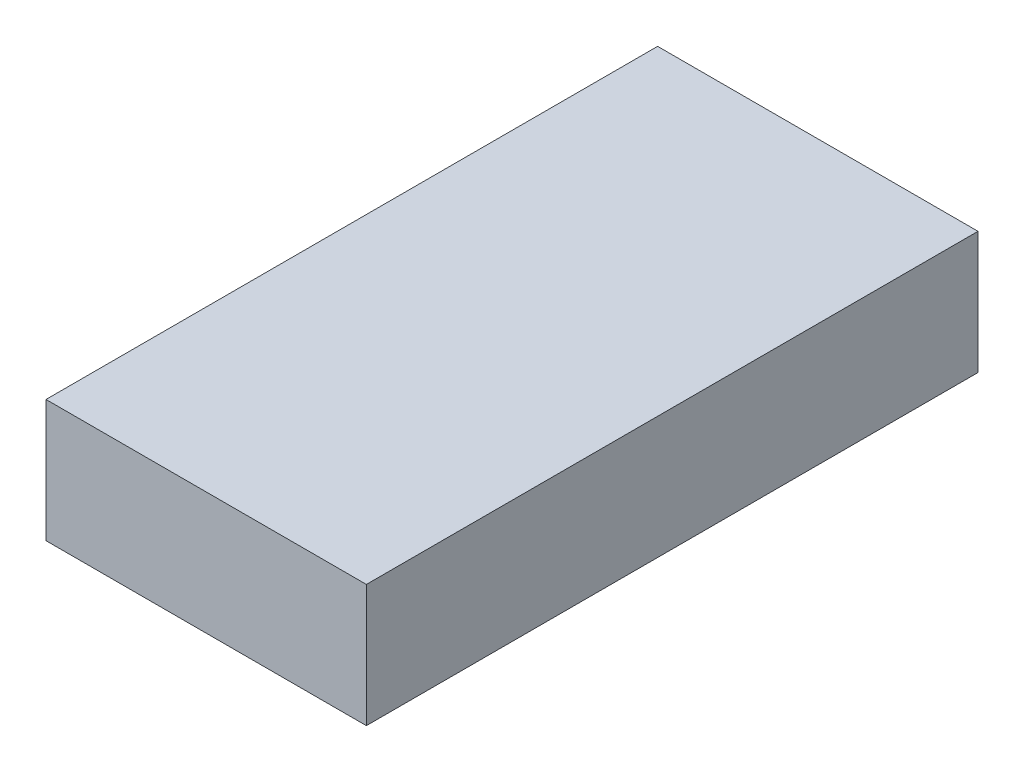
ISO-10303-21;
HEADER;
FILE_DESCRIPTION(('STEP AP214'),'2;1');
FILE_NAME('part.step','',(''),(''),'','','');
FILE_SCHEMA(('AUTOMOTIVE_DESIGN { 1 0 10303 214 1 1 1 1 }'));
ENDSEC;
DATA;
#1=APPLICATION_CONTEXT('core data for automotive mechanical design processes');
#2=APPLICATION_PROTOCOL_DEFINITION('international standard','automotive_design',2000,#1);
#3=PRODUCT_CONTEXT('',#1,'mechanical');
#4=PRODUCT('Part','Part','',(#3));
#5=PRODUCT_RELATED_PRODUCT_CATEGORY('part','',(#4));
#6=PRODUCT_DEFINITION_FORMATION('','',#4);
#7=PRODUCT_DEFINITION_CONTEXT('part definition',#1,'design');
#8=PRODUCT_DEFINITION('design','',#6,#7);
#9=PRODUCT_DEFINITION_SHAPE('','',#8);
#10=(LENGTH_UNIT() NAMED_UNIT(*) SI_UNIT(.MILLI.,.METRE.));
#11=(NAMED_UNIT(*) PLANE_ANGLE_UNIT() SI_UNIT($,.RADIAN.));
#12=(NAMED_UNIT(*) SI_UNIT($,.STERADIAN.) SOLID_ANGLE_UNIT());
#13=UNCERTAINTY_MEASURE_WITH_UNIT(LENGTH_MEASURE(1.E-05),#10,'distance_accuracy_value','');
#14=(GEOMETRIC_REPRESENTATION_CONTEXT(3) GLOBAL_UNCERTAINTY_ASSIGNED_CONTEXT((#13)) GLOBAL_UNIT_ASSIGNED_CONTEXT((#10,
#11,#12)) REPRESENTATION_CONTEXT('',''));
#15=CARTESIAN_POINT('',(0.,0.,0.));
#16=DIRECTION('',(0.,0.,1.));
#17=DIRECTION('',(1.,0.,0.));
#18=AXIS2_PLACEMENT_3D('',#15,#16,#17);
#19=CARTESIAN_POINT('',(13.97,10.668,26.67));
#20=DIRECTION('',(-1.,0.,0.));
#21=DIRECTION('',(0.,0.,1.));
#22=AXIS2_PLACEMENT_3D('',#19,#20,#21);
#23=PLANE('',#22);
#24=DIRECTION('',(0.,0.,-1.));
#25=VECTOR('',#24,1.);
#26=CARTESIAN_POINT('',(13.97,0.,26.67));
#27=LINE('',#26,#25);
#28=CARTESIAN_POINT('',(13.97,0.,26.67));
#29=VERTEX_POINT('',#28);
#30=CARTESIAN_POINT('',(13.97,0.,-26.67));
#31=VERTEX_POINT('',#30);
#32=EDGE_CURVE('E100',#29,#31,#27,.T.);
#33=ORIENTED_EDGE('',*,*,#32,.T.);
#34=DIRECTION('',(0.,-1.,0.));
#35=VECTOR('',#34,1.);
#36=CARTESIAN_POINT('',(13.97,10.668,-26.67));
#37=LINE('',#36,#35);
#38=CARTESIAN_POINT('',(13.97,10.668,-26.67));
#39=VERTEX_POINT('',#38);
#40=EDGE_CURVE('E11',#39,#31,#37,.T.);
#41=ORIENTED_EDGE('',*,*,#40,.F.);
#42=DIRECTION('',(0.,0.,-1.));
#43=VECTOR('',#42,1.);
#44=CARTESIAN_POINT('',(13.97,10.668,26.67));
#45=LINE('',#44,#43);
#46=CARTESIAN_POINT('',(13.97,10.668,26.67));
#47=VERTEX_POINT('',#46);
#48=EDGE_CURVE('E88',#47,#39,#45,.T.);
#49=ORIENTED_EDGE('',*,*,#48,.F.);
#50=DIRECTION('',(0.,-1.,0.));
#51=VECTOR('',#50,1.);
#52=CARTESIAN_POINT('',(13.97,10.668,26.67));
#53=LINE('',#52,#51);
#54=EDGE_CURVE('E96',#47,#29,#53,.T.);
#55=ORIENTED_EDGE('',*,*,#54,.T.);
#56=EDGE_LOOP('',(#33,#41,#49,#55));
#57=FACE_BOUND('',#56,.T.);
#58=ADVANCED_FACE('F37',(#57),#23,.F.);
#59=CARTESIAN_POINT('',(-13.97,10.668,-26.67));
#60=DIRECTION('',(0.,0.,1.));
#61=DIRECTION('',(1.,0.,0.));
#62=AXIS2_PLACEMENT_3D('',#59,#60,#61);
#63=PLANE('',#62);
#64=DIRECTION('',(-1.,0.,0.));
#65=VECTOR('',#64,1.);
#66=CARTESIAN_POINT('',(-13.97,0.,-26.67));
#67=LINE('',#66,#65);
#68=CARTESIAN_POINT('',(-13.97,0.,-26.67));
#69=VERTEX_POINT('',#68);
#70=EDGE_CURVE('E92',#31,#69,#67,.T.);
#71=ORIENTED_EDGE('',*,*,#70,.T.);
#72=DIRECTION('',(0.,-1.,0.));
#73=VECTOR('',#72,1.);
#74=CARTESIAN_POINT('',(-13.97,10.668,-26.67));
#75=LINE('',#74,#73);
#76=CARTESIAN_POINT('',(-13.97,10.668,-26.67));
#77=VERTEX_POINT('',#76);
#78=EDGE_CURVE('E45',#77,#69,#75,.T.);
#79=ORIENTED_EDGE('',*,*,#78,.F.);
#80=DIRECTION('',(-1.,0.,0.));
#81=VECTOR('',#80,1.);
#82=CARTESIAN_POINT('',(-13.97,10.668,-26.67));
#83=LINE('',#82,#81);
#84=EDGE_CURVE('E83',#39,#77,#83,.T.);
#85=ORIENTED_EDGE('',*,*,#84,.F.);
#86=ORIENTED_EDGE('',*,*,#40,.T.);
#87=EDGE_LOOP('',(#71,#79,#85,#86));
#88=FACE_BOUND('',#87,.T.);
#89=ADVANCED_FACE('F91',(#88),#63,.F.);
#90=CARTESIAN_POINT('',(-13.97,10.668,26.67));
#91=DIRECTION('',(1.,0.,0.));
#92=DIRECTION('',(0.,0.,-1.));
#93=AXIS2_PLACEMENT_3D('',#90,#91,#92);
#94=PLANE('',#93);
#95=DIRECTION('',(0.,0.,1.));
#96=VECTOR('',#95,1.);
#97=CARTESIAN_POINT('',(-13.97,0.,26.67));
#98=LINE('',#97,#96);
#99=CARTESIAN_POINT('',(-13.97,0.,26.67));
#100=VERTEX_POINT('',#99);
#101=EDGE_CURVE('E70',#69,#100,#98,.T.);
#102=ORIENTED_EDGE('',*,*,#101,.T.);
#103=DIRECTION('',(0.,-1.,0.));
#104=VECTOR('',#103,1.);
#105=CARTESIAN_POINT('',(-13.97,10.668,26.67));
#106=LINE('',#105,#104);
#107=CARTESIAN_POINT('',(-13.97,10.668,26.67));
#108=VERTEX_POINT('',#107);
#109=EDGE_CURVE('E93',#108,#100,#106,.T.);
#110=ORIENTED_EDGE('',*,*,#109,.F.);
#111=DIRECTION('',(0.,0.,1.));
#112=VECTOR('',#111,1.);
#113=CARTESIAN_POINT('',(-13.97,10.668,26.67));
#114=LINE('',#113,#112);
#115=EDGE_CURVE('E86',#77,#108,#114,.T.);
#116=ORIENTED_EDGE('',*,*,#115,.F.);
#117=ORIENTED_EDGE('',*,*,#78,.T.);
#118=EDGE_LOOP('',(#102,#110,#116,#117));
#119=FACE_BOUND('',#118,.T.);
#120=ADVANCED_FACE('F94',(#119),#94,.F.);
#121=CARTESIAN_POINT('',(-13.97,10.668,26.67));
#122=DIRECTION('',(0.,0.,-1.));
#123=DIRECTION('',(-1.,0.,0.));
#124=AXIS2_PLACEMENT_3D('',#121,#122,#123);
#125=PLANE('',#124);
#126=DIRECTION('',(1.,0.,0.));
#127=VECTOR('',#126,1.);
#128=CARTESIAN_POINT('',(-13.97,0.,26.67));
#129=LINE('',#128,#127);
#130=EDGE_CURVE('E76',#100,#29,#129,.T.);
#131=ORIENTED_EDGE('',*,*,#130,.T.);
#132=ORIENTED_EDGE('',*,*,#54,.F.);
#133=DIRECTION('',(1.,0.,0.));
#134=VECTOR('',#133,1.);
#135=CARTESIAN_POINT('',(-13.97,10.668,26.67));
#136=LINE('',#135,#134);
#137=EDGE_CURVE('E53',#108,#47,#136,.T.);
#138=ORIENTED_EDGE('',*,*,#137,.F.);
#139=ORIENTED_EDGE('',*,*,#109,.T.);
#140=EDGE_LOOP('',(#131,#132,#138,#139));
#141=FACE_BOUND('',#140,.T.);
#142=ADVANCED_FACE('F107',(#141),#125,.F.);
#143=CARTESIAN_POINT('',(0.,10.668,0.));
#144=DIRECTION('',(0.,-1.,0.));
#145=DIRECTION('',(0.,0.,-1.));
#146=AXIS2_PLACEMENT_3D('',#143,#144,#145);
#147=PLANE('',#146);
#148=ORIENTED_EDGE('',*,*,#48,.T.);
#149=ORIENTED_EDGE('',*,*,#84,.T.);
#150=ORIENTED_EDGE('',*,*,#115,.T.);
#151=ORIENTED_EDGE('',*,*,#137,.T.);
#152=EDGE_LOOP('',(#148,#149,#150,#151));
#153=FACE_BOUND('',#152,.T.);
#154=ADVANCED_FACE('F84',(#153),#147,.F.);
#155=CARTESIAN_POINT('',(0.,0.,0.));
#156=DIRECTION('',(0.,-1.,0.));
#157=DIRECTION('',(0.,0.,-1.));
#158=AXIS2_PLACEMENT_3D('',#155,#156,#157);
#159=PLANE('',#158);
#160=ORIENTED_EDGE('',*,*,#32,.F.);
#161=ORIENTED_EDGE('',*,*,#130,.F.);
#162=ORIENTED_EDGE('',*,*,#101,.F.);
#163=ORIENTED_EDGE('',*,*,#70,.F.);
#164=EDGE_LOOP('',(#160,#161,#162,#163));
#165=FACE_BOUND('',#164,.T.);
#166=ADVANCED_FACE('F110',(#165),#159,.T.);
#167=CLOSED_SHELL('',(#58,#89,#120,#142,#154,#166));
#168=MANIFOLD_SOLID_BREP('B2',#167);
#169=ADVANCED_BREP_SHAPE_REPRESENTATION('',(#18,#168),#14);
#170=SHAPE_DEFINITION_REPRESENTATION(#9,#169);
ENDSEC;
END-ISO-10303-21;
